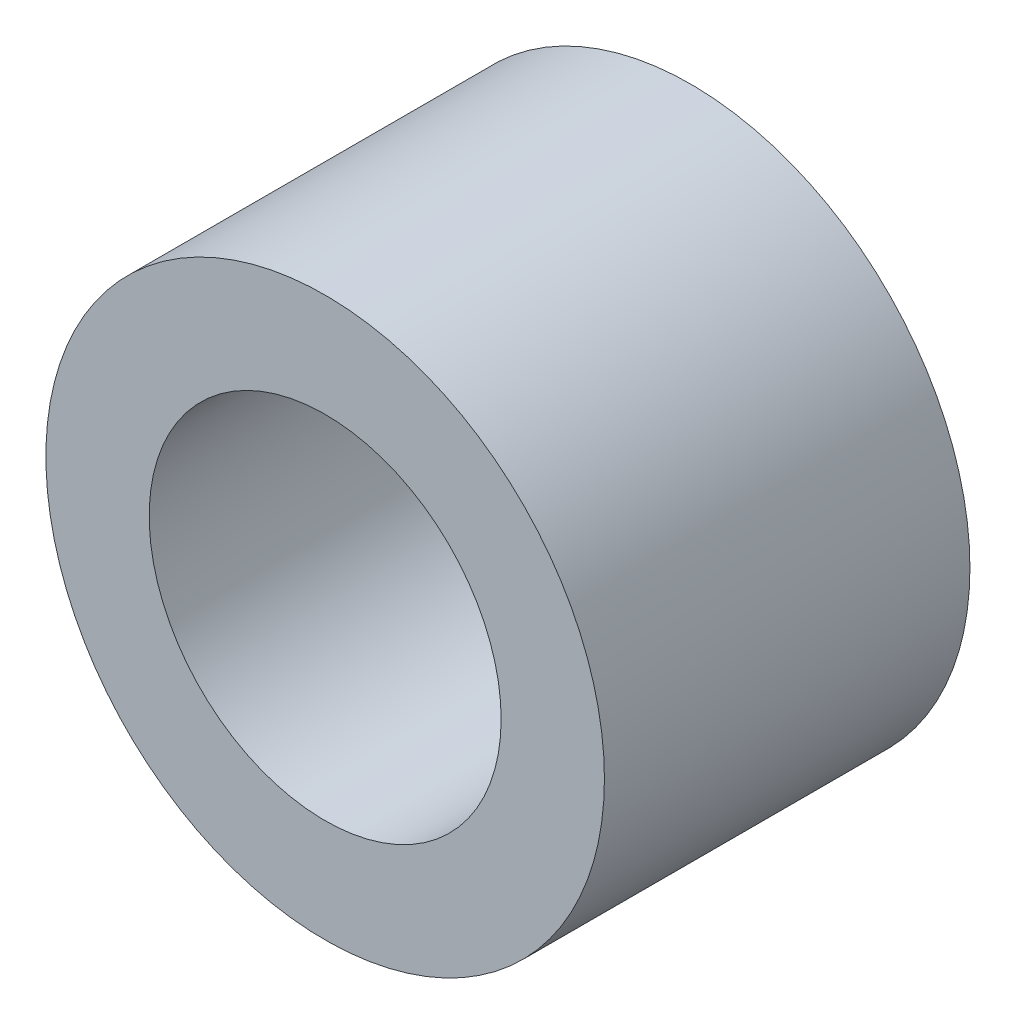
ISO-10303-21;
HEADER;
FILE_DESCRIPTION(('STEP AP214'),'2;1');
FILE_NAME('part.step','',(''),(''),'','','');
FILE_SCHEMA(('AUTOMOTIVE_DESIGN { 1 0 10303 214 1 1 1 1 }'));
ENDSEC;
DATA;
#1=APPLICATION_CONTEXT('core data for automotive mechanical design processes');
#2=APPLICATION_PROTOCOL_DEFINITION('international standard','automotive_design',2000,#1);
#3=PRODUCT_CONTEXT('',#1,'mechanical');
#4=PRODUCT('Part','Part','',(#3));
#5=PRODUCT_RELATED_PRODUCT_CATEGORY('part','',(#4));
#6=PRODUCT_DEFINITION_FORMATION('','',#4);
#7=PRODUCT_DEFINITION_CONTEXT('part definition',#1,'design');
#8=PRODUCT_DEFINITION('design','',#6,#7);
#9=PRODUCT_DEFINITION_SHAPE('','',#8);
#10=(LENGTH_UNIT() NAMED_UNIT(*) SI_UNIT(.MILLI.,.METRE.));
#11=(NAMED_UNIT(*) PLANE_ANGLE_UNIT() SI_UNIT($,.RADIAN.));
#12=(NAMED_UNIT(*) SI_UNIT($,.STERADIAN.) SOLID_ANGLE_UNIT());
#13=UNCERTAINTY_MEASURE_WITH_UNIT(LENGTH_MEASURE(1.E-05),#10,'distance_accuracy_value','');
#14=(GEOMETRIC_REPRESENTATION_CONTEXT(3) GLOBAL_UNCERTAINTY_ASSIGNED_CONTEXT((#13)) GLOBAL_UNIT_ASSIGNED_CONTEXT((#10,
#11,#12)) REPRESENTATION_CONTEXT('',''));
#15=CARTESIAN_POINT('',(0.,0.,0.));
#16=DIRECTION('',(0.,0.,1.));
#17=DIRECTION('',(1.,0.,0.));
#18=AXIS2_PLACEMENT_3D('',#15,#16,#17);
#19=CARTESIAN_POINT('',(0.,0.,6.21));
#20=DIRECTION('',(0.,0.,1.));
#21=DIRECTION('',(1.,0.,0.));
#22=AXIS2_PLACEMENT_3D('',#19,#20,#21);
#23=PLANE('',#22);
#24=CARTESIAN_POINT('',(0.,0.,6.21));
#25=DIRECTION('',(0.,0.,1.));
#26=DIRECTION('',(1.,0.,0.));
#27=AXIS2_PLACEMENT_3D('',#24,#25,#26);
#28=CIRCLE('',#27,4.745);
#29=CARTESIAN_POINT('',(4.745,0.,6.21));
#30=VERTEX_POINT('',#29);
#31=EDGE_CURVE('E10',#30,#30,#28,.T.);
#32=ORIENTED_EDGE('',*,*,#31,.T.);
#33=EDGE_LOOP('',(#32));
#34=FACE_BOUND('',#33,.T.);
#35=CARTESIAN_POINT('',(0.,0.,6.21));
#36=DIRECTION('',(0.,0.,1.));
#37=DIRECTION('',(1.,0.,0.));
#38=AXIS2_PLACEMENT_3D('',#35,#36,#37);
#39=CIRCLE('',#38,2.99);
#40=CARTESIAN_POINT('',(2.99,0.,6.21));
#41=VERTEX_POINT('',#40);
#42=EDGE_CURVE('E43',#41,#41,#39,.T.);
#43=ORIENTED_EDGE('',*,*,#42,.F.);
#44=EDGE_LOOP('',(#43));
#45=FACE_BOUND('',#44,.T.);
#46=ADVANCED_FACE('F32',(#34,#45),#23,.T.);
#47=CARTESIAN_POINT('',(0.,0.,0.));
#48=DIRECTION('',(0.,0.,1.));
#49=DIRECTION('',(1.,0.,0.));
#50=AXIS2_PLACEMENT_3D('',#47,#48,#49);
#51=PLANE('',#50);
#52=CARTESIAN_POINT('',(0.,0.,0.));
#53=DIRECTION('',(0.,0.,1.));
#54=DIRECTION('',(1.,0.,0.));
#55=AXIS2_PLACEMENT_3D('',#52,#53,#54);
#56=CIRCLE('',#55,4.745);
#57=CARTESIAN_POINT('',(4.745,0.,0.));
#58=VERTEX_POINT('',#57);
#59=EDGE_CURVE('E36',#58,#58,#56,.T.);
#60=ORIENTED_EDGE('',*,*,#59,.F.);
#61=EDGE_LOOP('',(#60));
#62=FACE_BOUND('',#61,.T.);
#63=CARTESIAN_POINT('',(0.,0.,0.));
#64=DIRECTION('',(0.,0.,1.));
#65=DIRECTION('',(1.,0.,0.));
#66=AXIS2_PLACEMENT_3D('',#63,#64,#65);
#67=CIRCLE('',#66,2.99);
#68=CARTESIAN_POINT('',(2.99,0.,0.));
#69=VERTEX_POINT('',#68);
#70=EDGE_CURVE('E45',#69,#69,#67,.T.);
#71=ORIENTED_EDGE('',*,*,#70,.T.);
#72=EDGE_LOOP('',(#71));
#73=FACE_BOUND('',#72,.T.);
#74=ADVANCED_FACE('F55',(#62,#73),#51,.F.);
#75=CARTESIAN_POINT('',(0.,0.,6.21));
#76=DIRECTION('',(0.,0.,-1.));
#77=DIRECTION('',(-1.,0.,0.));
#78=AXIS2_PLACEMENT_3D('',#75,#76,#77);
#79=CYLINDRICAL_SURFACE('',#78,4.745);
#80=ORIENTED_EDGE('',*,*,#31,.F.);
#81=EDGE_LOOP('',(#80));
#82=FACE_BOUND('',#81,.T.);
#83=ORIENTED_EDGE('',*,*,#59,.T.);
#84=EDGE_LOOP('',(#83));
#85=FACE_BOUND('',#84,.T.);
#86=ADVANCED_FACE('F34',(#82,#85),#79,.T.);
#87=CARTESIAN_POINT('',(0.,0.,6.21));
#88=DIRECTION('',(0.,0.,-1.));
#89=DIRECTION('',(-1.,0.,0.));
#90=AXIS2_PLACEMENT_3D('',#87,#88,#89);
#91=CYLINDRICAL_SURFACE('',#90,2.99);
#92=ORIENTED_EDGE('',*,*,#42,.T.);
#93=EDGE_LOOP('',(#92));
#94=FACE_BOUND('',#93,.T.);
#95=ORIENTED_EDGE('',*,*,#70,.F.);
#96=EDGE_LOOP('',(#95));
#97=FACE_BOUND('',#96,.T.);
#98=ADVANCED_FACE('F51',(#94,#97),#91,.F.);
#99=CLOSED_SHELL('',(#46,#74,#86,#98));
#100=MANIFOLD_SOLID_BREP('B2',#99);
#101=ADVANCED_BREP_SHAPE_REPRESENTATION('',(#18,#100),#14);
#102=SHAPE_DEFINITION_REPRESENTATION(#9,#101);
ENDSEC;
END-ISO-10303-21;
